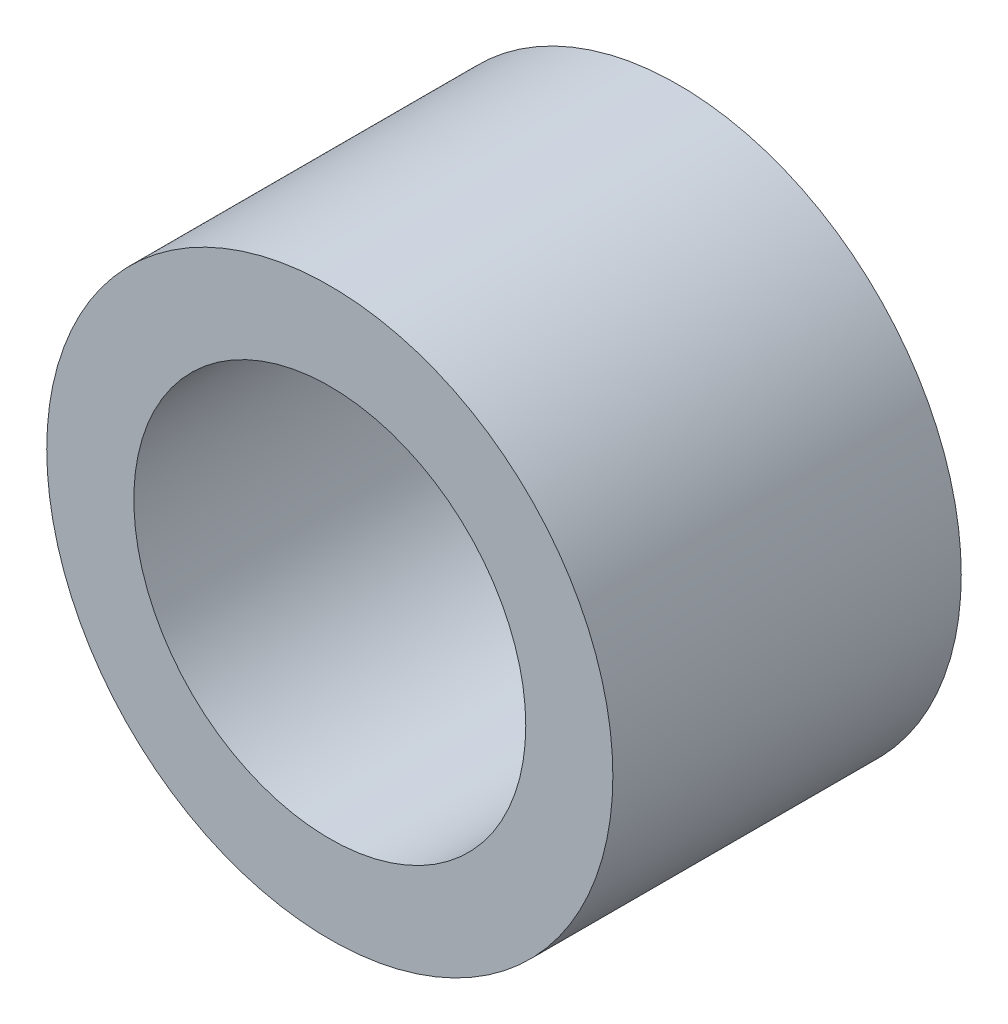
ISO-10303-21;
HEADER;
FILE_DESCRIPTION(('STEP AP214'),'2;1');
FILE_NAME('part.step','',(''),(''),'','','');
FILE_SCHEMA(('AUTOMOTIVE_DESIGN { 1 0 10303 214 1 1 1 1 }'));
ENDSEC;
DATA;
#1=APPLICATION_CONTEXT('core data for automotive mechanical design processes');
#2=APPLICATION_PROTOCOL_DEFINITION('international standard','automotive_design',2000,#1);
#3=PRODUCT_CONTEXT('',#1,'mechanical');
#4=PRODUCT('Part','Part','',(#3));
#5=PRODUCT_RELATED_PRODUCT_CATEGORY('part','',(#4));
#6=PRODUCT_DEFINITION_FORMATION('','',#4);
#7=PRODUCT_DEFINITION_CONTEXT('part definition',#1,'design');
#8=PRODUCT_DEFINITION('design','',#6,#7);
#9=PRODUCT_DEFINITION_SHAPE('','',#8);
#10=(LENGTH_UNIT() NAMED_UNIT(*) SI_UNIT(.MILLI.,.METRE.));
#11=(NAMED_UNIT(*) PLANE_ANGLE_UNIT() SI_UNIT($,.RADIAN.));
#12=(NAMED_UNIT(*) SI_UNIT($,.STERADIAN.) SOLID_ANGLE_UNIT());
#13=UNCERTAINTY_MEASURE_WITH_UNIT(LENGTH_MEASURE(1.E-05),#10,'distance_accuracy_value','');
#14=(GEOMETRIC_REPRESENTATION_CONTEXT(3) GLOBAL_UNCERTAINTY_ASSIGNED_CONTEXT((#13)) GLOBAL_UNIT_ASSIGNED_CONTEXT((#10,
#11,#12)) REPRESENTATION_CONTEXT('',''));
#15=CARTESIAN_POINT('',(0.,0.,0.));
#16=DIRECTION('',(0.,0.,1.));
#17=DIRECTION('',(1.,0.,0.));
#18=AXIS2_PLACEMENT_3D('',#15,#16,#17);
#19=CARTESIAN_POINT('',(0.,0.,4.));
#20=DIRECTION('',(0.,0.,1.));
#21=DIRECTION('',(1.,0.,0.));
#22=AXIS2_PLACEMENT_3D('',#19,#20,#21);
#23=PLANE('',#22);
#24=CARTESIAN_POINT('',(0.,0.,4.));
#25=DIRECTION('',(0.,0.,1.));
#26=DIRECTION('',(1.,0.,0.));
#27=AXIS2_PLACEMENT_3D('',#24,#25,#26);
#28=CIRCLE('',#27,3.25);
#29=CARTESIAN_POINT('',(3.25,0.,4.));
#30=VERTEX_POINT('',#29);
#31=EDGE_CURVE('E10',#30,#30,#28,.T.);
#32=ORIENTED_EDGE('',*,*,#31,.T.);
#33=EDGE_LOOP('',(#32));
#34=FACE_BOUND('',#33,.T.);
#35=CARTESIAN_POINT('',(0.,0.,4.));
#36=DIRECTION('',(0.,0.,1.));
#37=DIRECTION('',(1.,0.,0.));
#38=AXIS2_PLACEMENT_3D('',#35,#36,#37);
#39=CIRCLE('',#38,2.25);
#40=CARTESIAN_POINT('',(2.25,0.,4.));
#41=VERTEX_POINT('',#40);
#42=EDGE_CURVE('E41',#41,#41,#39,.T.);
#43=ORIENTED_EDGE('',*,*,#42,.F.);
#44=EDGE_LOOP('',(#43));
#45=FACE_BOUND('',#44,.T.);
#46=ADVANCED_FACE('F30',(#34,#45),#23,.T.);
#47=CARTESIAN_POINT('',(0.,0.,0.));
#48=DIRECTION('',(0.,0.,1.));
#49=DIRECTION('',(1.,0.,0.));
#50=AXIS2_PLACEMENT_3D('',#47,#48,#49);
#51=PLANE('',#50);
#52=CARTESIAN_POINT('',(0.,0.,0.));
#53=DIRECTION('',(0.,0.,1.));
#54=DIRECTION('',(1.,0.,0.));
#55=AXIS2_PLACEMENT_3D('',#52,#53,#54);
#56=CIRCLE('',#55,3.25);
#57=CARTESIAN_POINT('',(3.25,0.,0.));
#58=VERTEX_POINT('',#57);
#59=EDGE_CURVE('E34',#58,#58,#56,.T.);
#60=ORIENTED_EDGE('',*,*,#59,.F.);
#61=EDGE_LOOP('',(#60));
#62=FACE_BOUND('',#61,.T.);
#63=CARTESIAN_POINT('',(0.,0.,0.));
#64=DIRECTION('',(0.,0.,1.));
#65=DIRECTION('',(1.,0.,0.));
#66=AXIS2_PLACEMENT_3D('',#63,#64,#65);
#67=CIRCLE('',#66,2.25);
#68=CARTESIAN_POINT('',(2.25,0.,0.));
#69=VERTEX_POINT('',#68);
#70=EDGE_CURVE('E43',#69,#69,#67,.T.);
#71=ORIENTED_EDGE('',*,*,#70,.T.);
#72=EDGE_LOOP('',(#71));
#73=FACE_BOUND('',#72,.T.);
#74=ADVANCED_FACE('F53',(#62,#73),#51,.F.);
#75=CARTESIAN_POINT('',(0.,0.,4.));
#76=DIRECTION('',(0.,0.,-1.));
#77=DIRECTION('',(-1.,0.,0.));
#78=AXIS2_PLACEMENT_3D('',#75,#76,#77);
#79=CYLINDRICAL_SURFACE('',#78,3.25);
#80=ORIENTED_EDGE('',*,*,#31,.F.);
#81=EDGE_LOOP('',(#80));
#82=FACE_BOUND('',#81,.T.);
#83=ORIENTED_EDGE('',*,*,#59,.T.);
#84=EDGE_LOOP('',(#83));
#85=FACE_BOUND('',#84,.T.);
#86=ADVANCED_FACE('F32',(#82,#85),#79,.T.);
#87=CARTESIAN_POINT('',(0.,0.,4.));
#88=DIRECTION('',(0.,0.,-1.));
#89=DIRECTION('',(-1.,0.,0.));
#90=AXIS2_PLACEMENT_3D('',#87,#88,#89);
#91=CYLINDRICAL_SURFACE('',#90,2.25);
#92=ORIENTED_EDGE('',*,*,#42,.T.);
#93=EDGE_LOOP('',(#92));
#94=FACE_BOUND('',#93,.T.);
#95=ORIENTED_EDGE('',*,*,#70,.F.);
#96=EDGE_LOOP('',(#95));
#97=FACE_BOUND('',#96,.T.);
#98=ADVANCED_FACE('F49',(#94,#97),#91,.F.);
#99=CLOSED_SHELL('',(#46,#74,#86,#98));
#100=MANIFOLD_SOLID_BREP('B2',#99);
#101=ADVANCED_BREP_SHAPE_REPRESENTATION('',(#18,#100),#14);
#102=SHAPE_DEFINITION_REPRESENTATION(#9,#101);
ENDSEC;
END-ISO-10303-21;
